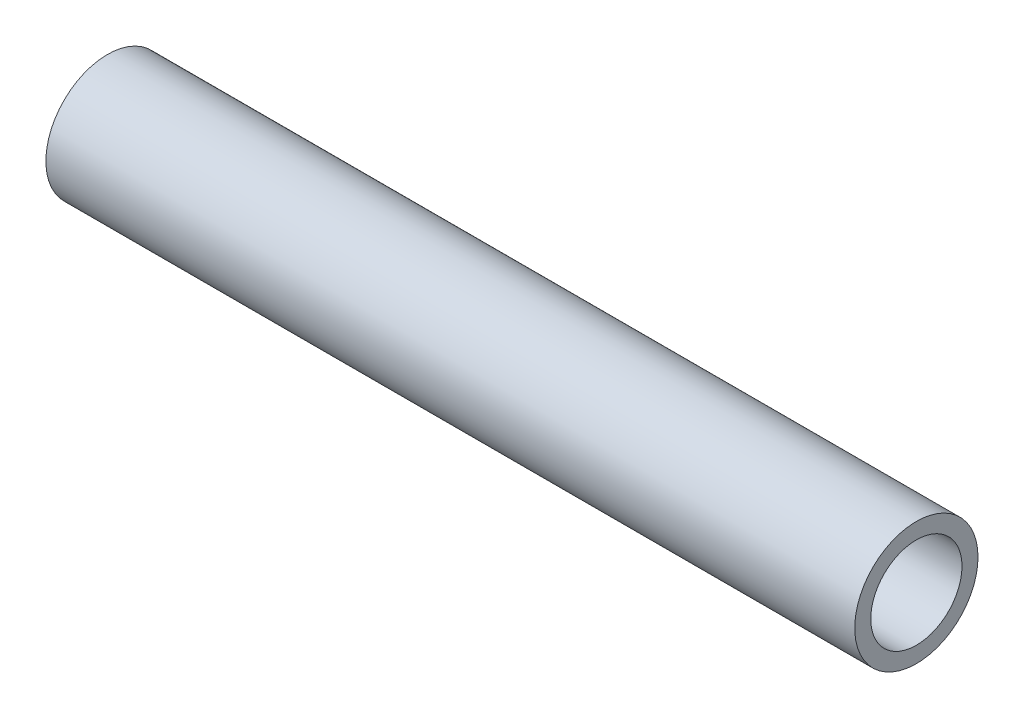
ISO-10303-21;
HEADER;
FILE_DESCRIPTION(('STEP AP214'),'2;1');
FILE_NAME('part.step','',(''),(''),'','','');
FILE_SCHEMA(('AUTOMOTIVE_DESIGN { 1 0 10303 214 1 1 1 1 }'));
ENDSEC;
DATA;
#1=APPLICATION_CONTEXT('core data for automotive mechanical design processes');
#2=APPLICATION_PROTOCOL_DEFINITION('international standard','automotive_design',2000,#1);
#3=PRODUCT_CONTEXT('',#1,'mechanical');
#4=PRODUCT('Part','Part','',(#3));
#5=PRODUCT_RELATED_PRODUCT_CATEGORY('part','',(#4));
#6=PRODUCT_DEFINITION_FORMATION('','',#4);
#7=PRODUCT_DEFINITION_CONTEXT('part definition',#1,'design');
#8=PRODUCT_DEFINITION('design','',#6,#7);
#9=PRODUCT_DEFINITION_SHAPE('','',#8);
#10=(LENGTH_UNIT() NAMED_UNIT(*) SI_UNIT(.MILLI.,.METRE.));
#11=(NAMED_UNIT(*) PLANE_ANGLE_UNIT() SI_UNIT($,.RADIAN.));
#12=(NAMED_UNIT(*) SI_UNIT($,.STERADIAN.) SOLID_ANGLE_UNIT());
#13=UNCERTAINTY_MEASURE_WITH_UNIT(LENGTH_MEASURE(1.E-05),#10,'distance_accuracy_value','');
#14=(GEOMETRIC_REPRESENTATION_CONTEXT(3) GLOBAL_UNCERTAINTY_ASSIGNED_CONTEXT((#13)) GLOBAL_UNIT_ASSIGNED_CONTEXT((#10,
#11,#12)) REPRESENTATION_CONTEXT('',''));
#15=CARTESIAN_POINT('',(0.,0.,0.));
#16=DIRECTION('',(0.,0.,1.));
#17=DIRECTION('',(1.,0.,0.));
#18=AXIS2_PLACEMENT_3D('',#15,#16,#17);
#19=CARTESIAN_POINT('',(70.,0.,0.));
#20=DIRECTION('',(-1.,0.,0.));
#21=DIRECTION('',(0.,0.,1.));
#22=AXIS2_PLACEMENT_3D('',#19,#20,#21);
#23=CYLINDRICAL_SURFACE('',#22,7.8994);
#24=CARTESIAN_POINT('',(70.,0.,0.));
#25=DIRECTION('',(1.,0.,0.));
#26=DIRECTION('',(0.,0.,-1.));
#27=AXIS2_PLACEMENT_3D('',#24,#25,#26);
#28=CIRCLE('',#27,7.8994);
#29=CARTESIAN_POINT('',(70.,0.,-7.8994));
#30=VERTEX_POINT('',#29);
#31=EDGE_CURVE('E56',#30,#30,#28,.T.);
#32=ORIENTED_EDGE('',*,*,#31,.T.);
#33=EDGE_LOOP('',(#32));
#34=FACE_BOUND('',#33,.T.);
#35=CARTESIAN_POINT('',(-70.,0.,0.));
#36=DIRECTION('',(1.,0.,0.));
#37=DIRECTION('',(0.,0.,-1.));
#38=AXIS2_PLACEMENT_3D('',#35,#36,#37);
#39=CIRCLE('',#38,7.8994);
#40=CARTESIAN_POINT('',(-70.,0.,-7.8994));
#41=VERTEX_POINT('',#40);
#42=EDGE_CURVE('E63',#41,#41,#39,.T.);
#43=ORIENTED_EDGE('',*,*,#42,.F.);
#44=EDGE_LOOP('',(#43));
#45=FACE_BOUND('',#44,.T.);
#46=ADVANCED_FACE('F48',(#34,#45),#23,.F.);
#47=CARTESIAN_POINT('',(70.,0.,0.));
#48=DIRECTION('',(-1.,0.,0.));
#49=DIRECTION('',(0.,0.,1.));
#50=AXIS2_PLACEMENT_3D('',#47,#48,#49);
#51=CYLINDRICAL_SURFACE('',#50,10.668);
#52=CARTESIAN_POINT('',(70.,0.,0.));
#53=DIRECTION('',(1.,0.,0.));
#54=DIRECTION('',(0.,0.,-1.));
#55=AXIS2_PLACEMENT_3D('',#52,#53,#54);
#56=CIRCLE('',#55,10.668);
#57=CARTESIAN_POINT('',(70.,0.,-10.668));
#58=VERTEX_POINT('',#57);
#59=EDGE_CURVE('E11',#58,#58,#56,.T.);
#60=ORIENTED_EDGE('',*,*,#59,.F.);
#61=EDGE_LOOP('',(#60));
#62=FACE_BOUND('',#61,.T.);
#63=CARTESIAN_POINT('',(-70.,0.,0.));
#64=DIRECTION('',(1.,0.,0.));
#65=DIRECTION('',(0.,0.,-1.));
#66=AXIS2_PLACEMENT_3D('',#63,#64,#65);
#67=CIRCLE('',#66,10.668);
#68=CARTESIAN_POINT('',(-70.,0.,-10.668));
#69=VERTEX_POINT('',#68);
#70=EDGE_CURVE('E51',#69,#69,#67,.T.);
#71=ORIENTED_EDGE('',*,*,#70,.T.);
#72=EDGE_LOOP('',(#71));
#73=FACE_BOUND('',#72,.T.);
#74=ADVANCED_FACE('F72',(#62,#73),#51,.T.);
#75=CARTESIAN_POINT('',(70.,0.,0.));
#76=DIRECTION('',(1.,0.,0.));
#77=DIRECTION('',(0.,0.,-1.));
#78=AXIS2_PLACEMENT_3D('',#75,#76,#77);
#79=PLANE('',#78);
#80=ORIENTED_EDGE('',*,*,#31,.F.);
#81=EDGE_LOOP('',(#80));
#82=FACE_BOUND('',#81,.T.);
#83=ORIENTED_EDGE('',*,*,#59,.T.);
#84=EDGE_LOOP('',(#83));
#85=FACE_BOUND('',#84,.T.);
#86=ADVANCED_FACE('F76',(#82,#85),#79,.T.);
#87=CARTESIAN_POINT('',(-70.,0.,0.));
#88=DIRECTION('',(1.,0.,0.));
#89=DIRECTION('',(0.,0.,-1.));
#90=AXIS2_PLACEMENT_3D('',#87,#88,#89);
#91=PLANE('',#90);
#92=ORIENTED_EDGE('',*,*,#42,.T.);
#93=EDGE_LOOP('',(#92));
#94=FACE_BOUND('',#93,.T.);
#95=ORIENTED_EDGE('',*,*,#70,.F.);
#96=EDGE_LOOP('',(#95));
#97=FACE_BOUND('',#96,.T.);
#98=ADVANCED_FACE('F74',(#94,#97),#91,.F.);
#99=CLOSED_SHELL('',(#46,#74,#86,#98));
#100=MANIFOLD_SOLID_BREP('B2',#99);
#101=ADVANCED_BREP_SHAPE_REPRESENTATION('',(#18,#100),#14);
#102=SHAPE_DEFINITION_REPRESENTATION(#9,#101);
ENDSEC;
END-ISO-10303-21;
